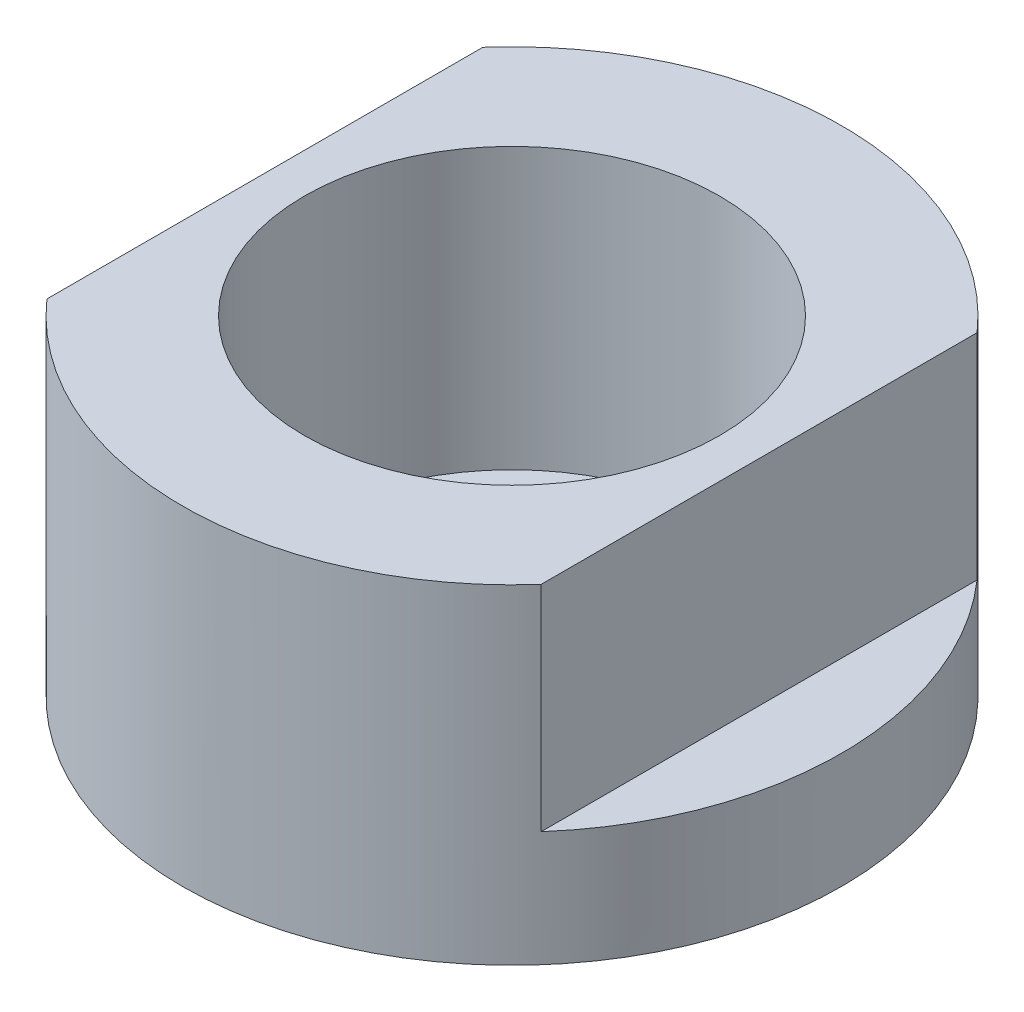
ISO-10303-21;
HEADER;
FILE_DESCRIPTION(('STEP AP214'),'2;1');
FILE_NAME('part.step','',(''),(''),'','','');
FILE_SCHEMA(('AUTOMOTIVE_DESIGN { 1 0 10303 214 1 1 1 1 }'));
ENDSEC;
DATA;
#1=APPLICATION_CONTEXT('core data for automotive mechanical design processes');
#2=APPLICATION_PROTOCOL_DEFINITION('international standard','automotive_design',2000,#1);
#3=PRODUCT_CONTEXT('',#1,'mechanical');
#4=PRODUCT('Part','Part','',(#3));
#5=PRODUCT_RELATED_PRODUCT_CATEGORY('part','',(#4));
#6=PRODUCT_DEFINITION_FORMATION('','',#4);
#7=PRODUCT_DEFINITION_CONTEXT('part definition',#1,'design');
#8=PRODUCT_DEFINITION('design','',#6,#7);
#9=PRODUCT_DEFINITION_SHAPE('','',#8);
#10=(LENGTH_UNIT() NAMED_UNIT(*) SI_UNIT(.MILLI.,.METRE.));
#11=(NAMED_UNIT(*) PLANE_ANGLE_UNIT() SI_UNIT($,.RADIAN.));
#12=(NAMED_UNIT(*) SI_UNIT($,.STERADIAN.) SOLID_ANGLE_UNIT());
#13=UNCERTAINTY_MEASURE_WITH_UNIT(LENGTH_MEASURE(1.E-05),#10,'distance_accuracy_value','');
#14=(GEOMETRIC_REPRESENTATION_CONTEXT(3) GLOBAL_UNCERTAINTY_ASSIGNED_CONTEXT((#13)) GLOBAL_UNIT_ASSIGNED_CONTEXT((#10,
#11,#12)) REPRESENTATION_CONTEXT('',''));
#15=CARTESIAN_POINT('',(0.,0.,0.));
#16=DIRECTION('',(0.,0.,1.));
#17=DIRECTION('',(1.,0.,0.));
#18=AXIS2_PLACEMENT_3D('',#15,#16,#17);
#19=CARTESIAN_POINT('',(0.,25.4,0.));
#20=DIRECTION('',(0.,-1.,0.));
#21=DIRECTION('',(0.,0.,-1.));
#22=AXIS2_PLACEMENT_3D('',#19,#20,#21);
#23=CYLINDRICAL_SURFACE('',#22,25.4);
#24=CARTESIAN_POINT('',(0.,0.,0.));
#25=DIRECTION('',(0.,1.,0.));
#26=DIRECTION('',(0.,0.,1.));
#27=AXIS2_PLACEMENT_3D('',#24,#25,#26);
#28=CIRCLE('',#27,25.4);
#29=CARTESIAN_POINT('',(0.,0.,25.4));
#30=VERTEX_POINT('',#29);
#31=EDGE_CURVE('E43',#30,#30,#28,.T.);
#32=ORIENTED_EDGE('',*,*,#31,.T.);
#33=EDGE_LOOP('',(#32));
#34=FACE_BOUND('',#33,.T.);
#35=DIRECTION('',(0.,-1.,0.));
#36=VECTOR('',#35,1.);
#37=CARTESIAN_POINT('',(19.05,25.4,16.8005208252602));
#38=LINE('',#37,#36);
#39=CARTESIAN_POINT('',(19.05,8.89,16.8005208252601));
#40=VERTEX_POINT('',#39);
#41=CARTESIAN_POINT('',(19.05,25.4,16.8005208252602));
#42=VERTEX_POINT('',#41);
#43=EDGE_CURVE('E87',#40,#42,#38,.F.);
#44=ORIENTED_EDGE('',*,*,#43,.T.);
#45=CARTESIAN_POINT('',(0.,25.4,0.));
#46=DIRECTION('',(0.,1.,0.));
#47=DIRECTION('',(0.,0.,1.));
#48=AXIS2_PLACEMENT_3D('',#45,#46,#47);
#49=CIRCLE('',#48,25.4);
#50=CARTESIAN_POINT('',(-19.05,25.4,16.8005208252601));
#51=VERTEX_POINT('',#50);
#52=EDGE_CURVE('E48',#51,#42,#49,.T.);
#53=ORIENTED_EDGE('',*,*,#52,.F.);
#54=DIRECTION('',(0.,-1.,0.));
#55=VECTOR('',#54,1.);
#56=CARTESIAN_POINT('',(-19.05,25.4,16.8005208252602));
#57=LINE('',#56,#55);
#58=CARTESIAN_POINT('',(-19.05,8.89,16.8005208252602));
#59=VERTEX_POINT('',#58);
#60=EDGE_CURVE('E55',#51,#59,#57,.T.);
#61=ORIENTED_EDGE('',*,*,#60,.T.);
#62=CARTESIAN_POINT('',(0.,8.89,0.));
#63=DIRECTION('',(0.,1.,0.));
#64=DIRECTION('',(0.,0.,1.));
#65=AXIS2_PLACEMENT_3D('',#62,#63,#64);
#66=CIRCLE('',#65,25.4);
#67=CARTESIAN_POINT('',(-19.05,8.89,-16.8005208252602));
#68=VERTEX_POINT('',#67);
#69=EDGE_CURVE('E108',#59,#68,#66,.F.);
#70=ORIENTED_EDGE('',*,*,#69,.T.);
#71=DIRECTION('',(0.,-1.,0.));
#72=VECTOR('',#71,1.);
#73=CARTESIAN_POINT('',(-19.05,25.4,-16.8005208252602));
#74=LINE('',#73,#72);
#75=CARTESIAN_POINT('',(-19.05,25.4,-16.8005208252601));
#76=VERTEX_POINT('',#75);
#77=EDGE_CURVE('E105',#76,#68,#74,.T.);
#78=ORIENTED_EDGE('',*,*,#77,.F.);
#79=CARTESIAN_POINT('',(19.05,25.4,-16.8005208252601));
#80=VERTEX_POINT('',#79);
#81=EDGE_CURVE('E12',#80,#76,#49,.T.);
#82=ORIENTED_EDGE('',*,*,#81,.F.);
#83=DIRECTION('',(0.,-1.,0.));
#84=VECTOR('',#83,1.);
#85=CARTESIAN_POINT('',(19.05,25.4,-16.8005208252602));
#86=LINE('',#85,#84);
#87=CARTESIAN_POINT('',(19.05,8.89,-16.8005208252601));
#88=VERTEX_POINT('',#87);
#89=EDGE_CURVE('E63',#88,#80,#86,.F.);
#90=ORIENTED_EDGE('',*,*,#89,.F.);
#91=CARTESIAN_POINT('',(0.,8.89,0.));
#92=DIRECTION('',(0.,1.,0.));
#93=DIRECTION('',(0.,0.,1.));
#94=AXIS2_PLACEMENT_3D('',#91,#92,#93);
#95=CIRCLE('',#94,25.4);
#96=EDGE_CURVE('E81',#88,#40,#95,.F.);
#97=ORIENTED_EDGE('',*,*,#96,.T.);
#98=EDGE_LOOP('',(#44,#53,#61,#70,#78,#82,#90,#97));
#99=FACE_BOUND('',#98,.T.);
#100=ADVANCED_FACE('F40',(#34,#99),#23,.T.);
#101=CARTESIAN_POINT('',(0.,25.4,0.));
#102=DIRECTION('',(0.,1.,0.));
#103=DIRECTION('',(0.,0.,1.));
#104=AXIS2_PLACEMENT_3D('',#101,#102,#103);
#105=PLANE('',#104);
#106=CARTESIAN_POINT('',(0.,25.4,0.));
#107=DIRECTION('',(0.,1.,0.));
#108=DIRECTION('',(0.,0.,1.));
#109=AXIS2_PLACEMENT_3D('',#106,#107,#108);
#110=CIRCLE('',#109,16.);
#111=CARTESIAN_POINT('',(0.,25.4,16.));
#112=VERTEX_POINT('',#111);
#113=EDGE_CURVE('E104',#112,#112,#110,.T.);
#114=ORIENTED_EDGE('',*,*,#113,.F.);
#115=EDGE_LOOP('',(#114));
#116=FACE_BOUND('',#115,.T.);
#117=ORIENTED_EDGE('',*,*,#52,.T.);
#118=DIRECTION('',(0.,0.,-1.));
#119=VECTOR('',#118,1.);
#120=CARTESIAN_POINT('',(19.05,25.4,25.401));
#121=LINE('',#120,#119);
#122=EDGE_CURVE('E90',#42,#80,#121,.T.);
#123=ORIENTED_EDGE('',*,*,#122,.T.);
#124=ORIENTED_EDGE('',*,*,#81,.T.);
#125=DIRECTION('',(0.,0.,-1.));
#126=VECTOR('',#125,1.);
#127=CARTESIAN_POINT('',(-19.05,25.4,25.401));
#128=LINE('',#127,#126);
#129=EDGE_CURVE('E96',#51,#76,#128,.T.);
#130=ORIENTED_EDGE('',*,*,#129,.F.);
#131=EDGE_LOOP('',(#117,#123,#124,#130));
#132=FACE_BOUND('',#131,.T.);
#133=ADVANCED_FACE('F128',(#116,#132),#105,.T.);
#134=CARTESIAN_POINT('',(0.,0.,0.));
#135=DIRECTION('',(0.,1.,0.));
#136=DIRECTION('',(0.,0.,1.));
#137=AXIS2_PLACEMENT_3D('',#134,#135,#136);
#138=PLANE('',#137);
#139=CARTESIAN_POINT('',(0.,0.,-8.89));
#140=DIRECTION('',(0.,1.,0.));
#141=DIRECTION('',(0.,0.,1.));
#142=AXIS2_PLACEMENT_3D('',#139,#140,#141);
#143=CIRCLE('',#142,1.);
#144=CARTESIAN_POINT('',(0.,0.,-7.89));
#145=VERTEX_POINT('',#144);
#146=EDGE_CURVE('E109',#145,#145,#143,.F.);
#147=ORIENTED_EDGE('',*,*,#146,.F.);
#148=EDGE_LOOP('',(#147));
#149=FACE_BOUND('',#148,.T.);
#150=CARTESIAN_POINT('',(7.6989658396442,0.,4.44499999999969));
#151=DIRECTION('',(0.,1.,0.));
#152=DIRECTION('',(0.,0.,1.));
#153=AXIS2_PLACEMENT_3D('',#150,#151,#152);
#154=CIRCLE('',#153,1.);
#155=CARTESIAN_POINT('',(7.6989658396442,0.,5.44499999999969));
#156=VERTEX_POINT('',#155);
#157=EDGE_CURVE('E265',#156,#156,#154,.F.);
#158=ORIENTED_EDGE('',*,*,#157,.F.);
#159=EDGE_LOOP('',(#158));
#160=FACE_BOUND('',#159,.T.);
#161=CARTESIAN_POINT('',(-7.69896583964312,0.,4.44500000000031));
#162=DIRECTION('',(0.,1.,0.));
#163=DIRECTION('',(0.,0.,1.));
#164=AXIS2_PLACEMENT_3D('',#161,#162,#163);
#165=CIRCLE('',#164,1.);
#166=CARTESIAN_POINT('',(-7.69896583964312,0.,5.44500000000031));
#167=VERTEX_POINT('',#166);
#168=EDGE_CURVE('E99',#167,#167,#165,.F.);
#169=ORIENTED_EDGE('',*,*,#168,.F.);
#170=EDGE_LOOP('',(#169));
#171=FACE_BOUND('',#170,.T.);
#172=ORIENTED_EDGE('',*,*,#31,.F.);
#173=EDGE_LOOP('',(#172));
#174=FACE_BOUND('',#173,.T.);
#175=ADVANCED_FACE('F125',(#149,#160,#171,#174),#138,.F.);
#176=CARTESIAN_POINT('',(0.,-45.254833995939,0.));
#177=DIRECTION('',(0.,1.,0.));
#178=DIRECTION('',(0.,0.,1.));
#179=AXIS2_PLACEMENT_3D('',#176,#177,#178);
#180=CYLINDRICAL_SURFACE('',#179,16.);
#181=CARTESIAN_POINT('',(0.,3.81,0.));
#182=DIRECTION('',(0.,1.,0.));
#183=DIRECTION('',(0.,0.,1.));
#184=AXIS2_PLACEMENT_3D('',#181,#182,#183);
#185=CIRCLE('',#184,16.);
#186=CARTESIAN_POINT('',(0.,3.80999999999999,16.));
#187=VERTEX_POINT('',#186);
#188=EDGE_CURVE('E116',#187,#187,#185,.F.);
#189=CARTESIAN_POINT('',(0.,3.80999999999999,16.));
#190=CARTESIAN_POINT('',(0.,4.03489583333333,16.));
#191=CARTESIAN_POINT('',(0.,4.25979166666666,16.));
#192=CARTESIAN_POINT('',(0.,4.70958333333333,16.));
#193=CARTESIAN_POINT('',(0.,4.93447916666666,16.));
#194=CARTESIAN_POINT('',(0.,5.38427083333333,16.));
#195=CARTESIAN_POINT('',(0.,5.60916666666666,16.));
#196=CARTESIAN_POINT('',(0.,6.05895833333333,16.));
#197=CARTESIAN_POINT('',(0.,6.28385416666666,16.));
#198=CARTESIAN_POINT('',(0.,6.73364583333333,16.));
#199=CARTESIAN_POINT('',(0.,6.95854166666666,16.));
#200=CARTESIAN_POINT('',(0.,7.40833333333333,16.));
#201=CARTESIAN_POINT('',(0.,7.63322916666666,16.));
#202=CARTESIAN_POINT('',(0.,8.08302083333333,16.));
#203=CARTESIAN_POINT('',(0.,8.30791666666667,16.));
#204=CARTESIAN_POINT('',(0.,8.75770833333333,16.));
#205=CARTESIAN_POINT('',(0.,8.98260416666666,16.));
#206=CARTESIAN_POINT('',(0.,9.43239583333333,16.));
#207=CARTESIAN_POINT('',(0.,9.65729166666666,16.));
#208=CARTESIAN_POINT('',(0.,10.1070833333333,16.));
#209=CARTESIAN_POINT('',(0.,10.3319791666667,16.));
#210=CARTESIAN_POINT('',(0.,10.7817708333333,16.));
#211=CARTESIAN_POINT('',(0.,11.0066666666667,16.));
#212=CARTESIAN_POINT('',(0.,11.4564583333333,16.));
#213=CARTESIAN_POINT('',(0.,11.6813541666667,16.));
#214=CARTESIAN_POINT('',(0.,12.1311458333333,16.));
#215=CARTESIAN_POINT('',(0.,12.3560416666667,16.));
#216=CARTESIAN_POINT('',(0.,12.8058333333333,16.));
#217=CARTESIAN_POINT('',(0.,13.0307291666667,16.));
#218=CARTESIAN_POINT('',(0.,13.4805208333333,16.));
#219=CARTESIAN_POINT('',(0.,13.7054166666667,16.));
#220=CARTESIAN_POINT('',(0.,14.1552083333333,16.));
#221=CARTESIAN_POINT('',(0.,14.3801041666667,16.));
#222=CARTESIAN_POINT('',(0.,14.8298958333333,16.));
#223=CARTESIAN_POINT('',(0.,15.0547916666667,16.));
#224=CARTESIAN_POINT('',(0.,15.5045833333333,16.));
#225=CARTESIAN_POINT('',(0.,15.7294791666667,16.));
#226=CARTESIAN_POINT('',(0.,16.1792708333333,16.));
#227=CARTESIAN_POINT('',(0.,16.4041666666667,16.));
#228=CARTESIAN_POINT('',(0.,16.8539583333333,16.));
#229=CARTESIAN_POINT('',(0.,17.0788541666667,16.));
#230=CARTESIAN_POINT('',(0.,17.5286458333333,16.));
#231=CARTESIAN_POINT('',(0.,17.7535416666667,16.));
#232=CARTESIAN_POINT('',(0.,18.2033333333333,16.));
#233=CARTESIAN_POINT('',(0.,18.4282291666667,16.));
#234=CARTESIAN_POINT('',(0.,18.8780208333333,16.));
#235=CARTESIAN_POINT('',(0.,19.1029166666667,16.));
#236=CARTESIAN_POINT('',(0.,19.5527083333333,16.));
#237=CARTESIAN_POINT('',(0.,19.7776041666667,16.));
#238=CARTESIAN_POINT('',(0.,20.2273958333333,16.));
#239=CARTESIAN_POINT('',(0.,20.4522916666667,16.));
#240=CARTESIAN_POINT('',(0.,20.9020833333333,16.));
#241=CARTESIAN_POINT('',(0.,21.1269791666667,16.));
#242=CARTESIAN_POINT('',(0.,21.5767708333333,16.));
#243=CARTESIAN_POINT('',(0.,21.8016666666667,16.));
#244=CARTESIAN_POINT('',(0.,22.2514583333333,16.));
#245=CARTESIAN_POINT('',(0.,22.4763541666667,16.));
#246=CARTESIAN_POINT('',(0.,22.9261458333333,16.));
#247=CARTESIAN_POINT('',(0.,23.1510416666667,16.));
#248=CARTESIAN_POINT('',(0.,23.6008333333333,16.));
#249=CARTESIAN_POINT('',(0.,23.8257291666667,16.));
#250=CARTESIAN_POINT('',(0.,24.2755208333333,16.));
#251=CARTESIAN_POINT('',(0.,24.5004166666667,16.));
#252=CARTESIAN_POINT('',(0.,24.9502083333333,16.));
#253=CARTESIAN_POINT('',(0.,25.1751041666667,16.));
#254=CARTESIAN_POINT('',(0.,25.4,16.));
#255=B_SPLINE_CURVE_WITH_KNOTS('',3,(#189,#190,#191,#192,#193,#194,#195,#196,#197,#198,#199,
#200,#201,#202,#203,#204,#205,#206,#207,#208,#209,#210,#211,#212,#213,#214,#215,#216,#217,#218,
#219,#220,#221,#222,#223,#224,#225,#226,#227,#228,#229,#230,#231,#232,#233,#234,#235,#236,#237,
#238,#239,#240,#241,#242,#243,#244,#245,#246,#247,#248,#249,#250,#251,#252,#253,#254),
.UNSPECIFIED.,.F.,.F.,(4,2,2,2,2,2,2,2,2,2,2,2,2,2,2,2,2,2,2,2,2,2,2,2,2,2,2,2,2,2,2,2,4),(0.,
0.6746875,1.349375,2.0240625,2.69875,3.3734375,4.048125,4.72281250000001,5.3975,
6.07218750000001,6.74687500000001,7.42156250000001,8.09625000000001,8.77093750000001,
9.44562500000001,10.1203125,10.795,11.4696875,12.144375,12.8190625,13.49375,14.1684375,
14.843125,15.5178125,16.1925,16.8671875,17.541875,18.2165625,18.89125,19.5659375,20.240625,
20.9153125,21.59),.UNSPECIFIED.);
#256=EDGE_CURVE('BSEAM127',#187,#112,#255,.T.);
#257=ORIENTED_EDGE('',*,*,#188,.T.);
#258=ORIENTED_EDGE('',*,*,#113,.T.);
#259=ORIENTED_EDGE('',*,*,#256,.T.);
#260=ORIENTED_EDGE('',*,*,#256,.F.);
#261=EDGE_LOOP('',(#257,#259,#258,#260));
#262=FACE_BOUND('',#261,.T.);
#263=ADVANCED_FACE('F127',(#262),#180,.F.);
#264=CARTESIAN_POINT('',(0.,3.81,0.));
#265=DIRECTION('',(0.,1.,0.));
#266=DIRECTION('',(0.,0.,1.));
#267=AXIS2_PLACEMENT_3D('',#264,#265,#266);
#268=PLANE('',#267);
#269=CARTESIAN_POINT('',(0.,3.81,-8.89));
#270=DIRECTION('',(0.,1.,0.));
#271=DIRECTION('',(0.,0.,1.));
#272=AXIS2_PLACEMENT_3D('',#269,#270,#271);
#273=CIRCLE('',#272,1.);
#274=CARTESIAN_POINT('',(0.,3.81,-7.89));
#275=VERTEX_POINT('',#274);
#276=EDGE_CURVE('E262',#275,#275,#273,.T.);
#277=ORIENTED_EDGE('',*,*,#276,.F.);
#278=EDGE_LOOP('',(#277));
#279=FACE_BOUND('',#278,.T.);
#280=CARTESIAN_POINT('',(7.6989658396442,3.81,4.44499999999969));
#281=DIRECTION('',(0.,1.,0.));
#282=DIRECTION('',(0.,0.,1.));
#283=AXIS2_PLACEMENT_3D('',#280,#281,#282);
#284=CIRCLE('',#283,1.);
#285=CARTESIAN_POINT('',(7.6989658396442,3.81,5.44499999999969));
#286=VERTEX_POINT('',#285);
#287=EDGE_CURVE('E268',#286,#286,#284,.T.);
#288=ORIENTED_EDGE('',*,*,#287,.F.);
#289=EDGE_LOOP('',(#288));
#290=FACE_BOUND('',#289,.T.);
#291=CARTESIAN_POINT('',(-7.69896583964312,3.81,4.44500000000031));
#292=DIRECTION('',(0.,1.,0.));
#293=DIRECTION('',(0.,0.,1.));
#294=AXIS2_PLACEMENT_3D('',#291,#292,#293);
#295=CIRCLE('',#294,1.);
#296=CARTESIAN_POINT('',(-7.69896583964312,3.81,5.44500000000031));
#297=VERTEX_POINT('',#296);
#298=EDGE_CURVE('E272',#297,#297,#295,.T.);
#299=ORIENTED_EDGE('',*,*,#298,.F.);
#300=EDGE_LOOP('',(#299));
#301=FACE_BOUND('',#300,.T.);
#302=ORIENTED_EDGE('',*,*,#188,.F.);
#303=EDGE_LOOP('',(#302));
#304=FACE_BOUND('',#303,.T.);
#305=ADVANCED_FACE('F134',(#279,#290,#301,#304),#268,.T.);
#306=CARTESIAN_POINT('',(-25.4,8.89,25.401));
#307=DIRECTION('',(0.,1.,0.));
#308=DIRECTION('',(0.,0.,1.));
#309=AXIS2_PLACEMENT_3D('',#306,#307,#308);
#310=PLANE('',#309);
#311=DIRECTION('',(0.,0.,-1.));
#312=VECTOR('',#311,1.);
#313=CARTESIAN_POINT('',(-19.05,8.89,25.401));
#314=LINE('',#313,#312);
#315=EDGE_CURVE('E94',#59,#68,#314,.T.);
#316=ORIENTED_EDGE('',*,*,#315,.T.);
#317=ORIENTED_EDGE('',*,*,#69,.F.);
#318=EDGE_LOOP('',(#316,#317));
#319=FACE_BOUND('',#318,.T.);
#320=ADVANCED_FACE('F169',(#319),#310,.T.);
#321=CARTESIAN_POINT('',(-19.05,25.4,25.401));
#322=DIRECTION('',(-1.,0.,0.));
#323=DIRECTION('',(0.,-1.,0.));
#324=AXIS2_PLACEMENT_3D('',#321,#322,#323);
#325=PLANE('',#324);
#326=ORIENTED_EDGE('',*,*,#129,.T.);
#327=ORIENTED_EDGE('',*,*,#77,.T.);
#328=ORIENTED_EDGE('',*,*,#315,.F.);
#329=ORIENTED_EDGE('',*,*,#60,.F.);
#330=EDGE_LOOP('',(#326,#327,#328,#329));
#331=FACE_BOUND('',#330,.T.);
#332=ADVANCED_FACE('F179',(#331),#325,.T.);
#333=CARTESIAN_POINT('',(19.05,25.4,25.401));
#334=DIRECTION('',(1.,0.,0.));
#335=DIRECTION('',(0.,1.,0.));
#336=AXIS2_PLACEMENT_3D('',#333,#334,#335);
#337=PLANE('',#336);
#338=DIRECTION('',(0.,0.,-1.));
#339=VECTOR('',#338,1.);
#340=CARTESIAN_POINT('',(19.05,8.89,25.401));
#341=LINE('',#340,#339);
#342=EDGE_CURVE('E83',#40,#88,#341,.T.);
#343=ORIENTED_EDGE('',*,*,#342,.T.);
#344=ORIENTED_EDGE('',*,*,#89,.T.);
#345=ORIENTED_EDGE('',*,*,#122,.F.);
#346=ORIENTED_EDGE('',*,*,#43,.F.);
#347=EDGE_LOOP('',(#343,#344,#345,#346));
#348=FACE_BOUND('',#347,.T.);
#349=ADVANCED_FACE('F89',(#348),#337,.T.);
#350=CARTESIAN_POINT('',(25.4,8.89,25.401));
#351=DIRECTION('',(0.,1.,0.));
#352=DIRECTION('',(0.,0.,1.));
#353=AXIS2_PLACEMENT_3D('',#350,#351,#352);
#354=PLANE('',#353);
#355=ORIENTED_EDGE('',*,*,#342,.F.);
#356=ORIENTED_EDGE('',*,*,#96,.F.);
#357=EDGE_LOOP('',(#355,#356));
#358=FACE_BOUND('',#357,.T.);
#359=ADVANCED_FACE('F82',(#358),#354,.T.);
#360=CARTESIAN_POINT('',(-7.69896583964312,-0.00100000000000013,4.44500000000031));
#361=DIRECTION('',(0.,1.,0.));
#362=DIRECTION('',(0.,0.,1.));
#363=AXIS2_PLACEMENT_3D('',#360,#361,#362);
#364=CYLINDRICAL_SURFACE('',#363,1.);
#365=ORIENTED_EDGE('',*,*,#298,.T.);
#366=EDGE_LOOP('',(#365));
#367=FACE_BOUND('',#366,.T.);
#368=ORIENTED_EDGE('',*,*,#168,.T.);
#369=EDGE_LOOP('',(#368));
#370=FACE_BOUND('',#369,.T.);
#371=ADVANCED_FACE('F190',(#367,#370),#364,.F.);
#372=CARTESIAN_POINT('',(7.6989658396442,-0.00100000000000013,4.44499999999969));
#373=DIRECTION('',(0.,1.,0.));
#374=DIRECTION('',(0.,0.,1.));
#375=AXIS2_PLACEMENT_3D('',#372,#373,#374);
#376=CYLINDRICAL_SURFACE('',#375,1.);
#377=ORIENTED_EDGE('',*,*,#287,.T.);
#378=EDGE_LOOP('',(#377));
#379=FACE_BOUND('',#378,.T.);
#380=ORIENTED_EDGE('',*,*,#157,.T.);
#381=EDGE_LOOP('',(#380));
#382=FACE_BOUND('',#381,.T.);
#383=ADVANCED_FACE('F200',(#379,#382),#376,.F.);
#384=CARTESIAN_POINT('',(0.,-0.00100000000000013,-8.89));
#385=DIRECTION('',(0.,1.,0.));
#386=DIRECTION('',(0.,0.,1.));
#387=AXIS2_PLACEMENT_3D('',#384,#385,#386);
#388=CYLINDRICAL_SURFACE('',#387,1.);
#389=ORIENTED_EDGE('',*,*,#276,.T.);
#390=EDGE_LOOP('',(#389));
#391=FACE_BOUND('',#390,.T.);
#392=ORIENTED_EDGE('',*,*,#146,.T.);
#393=EDGE_LOOP('',(#392));
#394=FACE_BOUND('',#393,.T.);
#395=ADVANCED_FACE('F210',(#391,#394),#388,.F.);
#396=CLOSED_SHELL('',(#100,#133,#175,#263,#305,#320,#332,#349,#359,#371,#383,#395));
#397=MANIFOLD_SOLID_BREP('B2',#396);
#398=ADVANCED_BREP_SHAPE_REPRESENTATION('',(#18,#397),#14);
#399=SHAPE_DEFINITION_REPRESENTATION(#9,#398);
ENDSEC;
END-ISO-10303-21;
